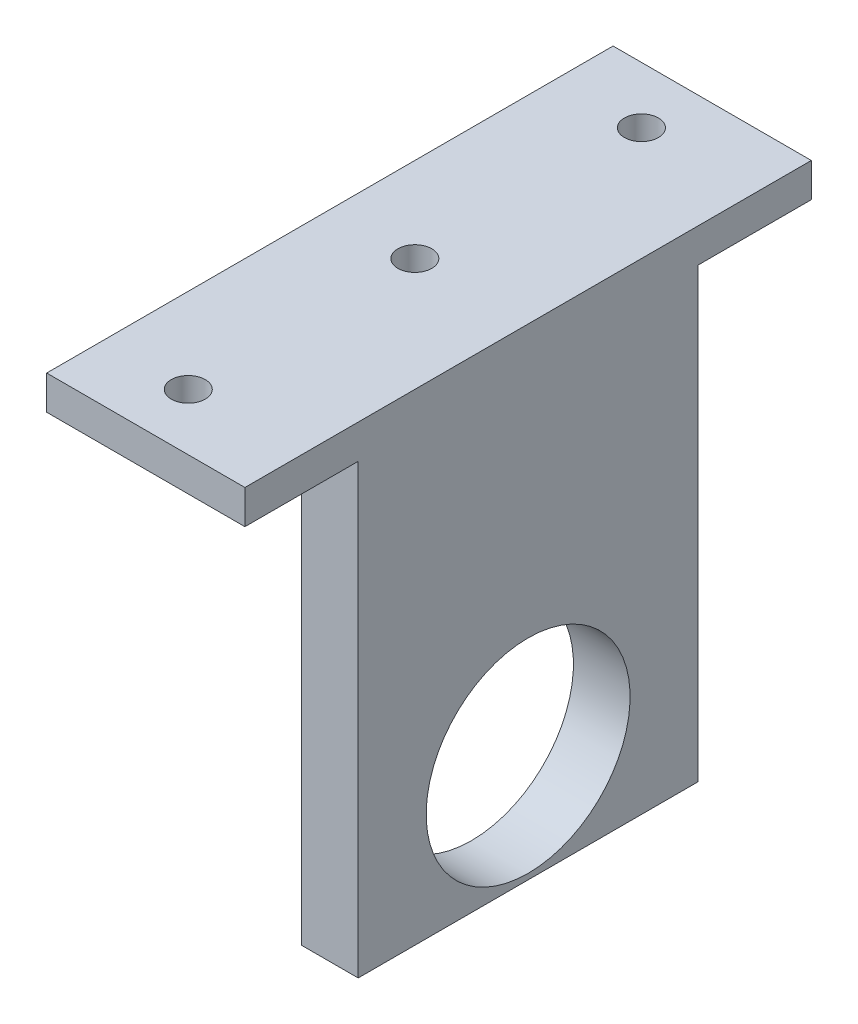
ISO-10303-21;
HEADER;
FILE_DESCRIPTION(('STEP AP214'),'2;1');
FILE_NAME('part.step','',(''),(''),'','','');
FILE_SCHEMA(('AUTOMOTIVE_DESIGN { 1 0 10303 214 1 1 1 1 }'));
ENDSEC;
DATA;
#1=APPLICATION_CONTEXT('core data for automotive mechanical design processes');
#2=APPLICATION_PROTOCOL_DEFINITION('international standard','automotive_design',2000,#1);
#3=PRODUCT_CONTEXT('',#1,'mechanical');
#4=PRODUCT('Part','Part','',(#3));
#5=PRODUCT_RELATED_PRODUCT_CATEGORY('part','',(#4));
#6=PRODUCT_DEFINITION_FORMATION('','',#4);
#7=PRODUCT_DEFINITION_CONTEXT('part definition',#1,'design');
#8=PRODUCT_DEFINITION('design','',#6,#7);
#9=PRODUCT_DEFINITION_SHAPE('','',#8);
#10=(LENGTH_UNIT() NAMED_UNIT(*) SI_UNIT(.MILLI.,.METRE.));
#11=(NAMED_UNIT(*) PLANE_ANGLE_UNIT() SI_UNIT($,.RADIAN.));
#12=(NAMED_UNIT(*) SI_UNIT($,.STERADIAN.) SOLID_ANGLE_UNIT());
#13=UNCERTAINTY_MEASURE_WITH_UNIT(LENGTH_MEASURE(1.E-05),#10,'distance_accuracy_value','');
#14=(GEOMETRIC_REPRESENTATION_CONTEXT(3) GLOBAL_UNCERTAINTY_ASSIGNED_CONTEXT((#13)) GLOBAL_UNIT_ASSIGNED_CONTEXT((#10,
#11,#12)) REPRESENTATION_CONTEXT('',''));
#15=CARTESIAN_POINT('',(0.,0.,0.));
#16=DIRECTION('',(0.,0.,1.));
#17=DIRECTION('',(1.,0.,0.));
#18=AXIS2_PLACEMENT_3D('',#15,#16,#17);
#19=CARTESIAN_POINT('',(5.,-28.5,15.));
#20=DIRECTION('',(0.,0.,1.));
#21=DIRECTION('',(1.,0.,0.));
#22=AXIS2_PLACEMENT_3D('',#19,#20,#21);
#23=PLANE('',#22);
#24=DIRECTION('',(0.,1.,0.));
#25=VECTOR('',#24,1.);
#26=CARTESIAN_POINT('',(0.,-28.5,15.));
#27=LINE('',#26,#25);
#28=CARTESIAN_POINT('',(0.,-28.5,15.));
#29=VERTEX_POINT('',#28);
#30=CARTESIAN_POINT('',(0.,11.,15.));
#31=VERTEX_POINT('',#30);
#32=EDGE_CURVE('E142',#29,#31,#27,.T.);
#33=ORIENTED_EDGE('',*,*,#32,.F.);
#34=DIRECTION('',(-1.,0.,0.));
#35=VECTOR('',#34,1.);
#36=CARTESIAN_POINT('',(5.,-28.5,15.));
#37=LINE('',#36,#35);
#38=CARTESIAN_POINT('',(5.,-28.5,15.));
#39=VERTEX_POINT('',#38);
#40=EDGE_CURVE('E11',#39,#29,#37,.T.);
#41=ORIENTED_EDGE('',*,*,#40,.F.);
#42=DIRECTION('',(0.,1.,0.));
#43=VECTOR('',#42,1.);
#44=CARTESIAN_POINT('',(5.,-28.5,15.));
#45=LINE('',#44,#43);
#46=CARTESIAN_POINT('',(5.,11.,15.));
#47=VERTEX_POINT('',#46);
#48=EDGE_CURVE('E75',#39,#47,#45,.T.);
#49=ORIENTED_EDGE('',*,*,#48,.T.);
#50=DIRECTION('',(-1.,0.,0.));
#51=VECTOR('',#50,1.);
#52=CARTESIAN_POINT('',(5.,11.,15.));
#53=LINE('',#52,#51);
#54=EDGE_CURVE('E42',#47,#31,#53,.T.);
#55=ORIENTED_EDGE('',*,*,#54,.T.);
#56=EDGE_LOOP('',(#33,#41,#49,#55));
#57=FACE_BOUND('',#56,.T.);
#58=ADVANCED_FACE('F39',(#57),#23,.T.);
#59=CARTESIAN_POINT('',(5.,-28.5,15.));
#60=DIRECTION('',(0.,1.,0.));
#61=DIRECTION('',(0.,0.,1.));
#62=AXIS2_PLACEMENT_3D('',#59,#60,#61);
#63=PLANE('',#62);
#64=DIRECTION('',(0.,0.,-1.));
#65=VECTOR('',#64,1.);
#66=CARTESIAN_POINT('',(0.,-28.5,15.));
#67=LINE('',#66,#65);
#68=CARTESIAN_POINT('',(0.,-28.5,-15.));
#69=VERTEX_POINT('',#68);
#70=EDGE_CURVE('E70',#29,#69,#67,.T.);
#71=ORIENTED_EDGE('',*,*,#70,.T.);
#72=DIRECTION('',(-1.,0.,0.));
#73=VECTOR('',#72,1.);
#74=CARTESIAN_POINT('',(5.,-28.5,-15.));
#75=LINE('',#74,#73);
#76=CARTESIAN_POINT('',(5.,-28.5,-15.));
#77=VERTEX_POINT('',#76);
#78=EDGE_CURVE('E48',#77,#69,#75,.T.);
#79=ORIENTED_EDGE('',*,*,#78,.F.);
#80=DIRECTION('',(0.,0.,-1.));
#81=VECTOR('',#80,1.);
#82=CARTESIAN_POINT('',(5.,-28.5,15.));
#83=LINE('',#82,#81);
#84=EDGE_CURVE('E147',#39,#77,#83,.T.);
#85=ORIENTED_EDGE('',*,*,#84,.F.);
#86=ORIENTED_EDGE('',*,*,#40,.T.);
#87=EDGE_LOOP('',(#71,#79,#85,#86));
#88=FACE_BOUND('',#87,.T.);
#89=ADVANCED_FACE('F185',(#88),#63,.F.);
#90=CARTESIAN_POINT('',(5.,-28.5,-15.));
#91=DIRECTION('',(0.,0.,1.));
#92=DIRECTION('',(1.,0.,0.));
#93=AXIS2_PLACEMENT_3D('',#90,#91,#92);
#94=PLANE('',#93);
#95=DIRECTION('',(0.,1.,0.));
#96=VECTOR('',#95,1.);
#97=CARTESIAN_POINT('',(0.,-28.5,-15.));
#98=LINE('',#97,#96);
#99=CARTESIAN_POINT('',(0.,11.,-15.));
#100=VERTEX_POINT('',#99);
#101=EDGE_CURVE('E153',#69,#100,#98,.T.);
#102=ORIENTED_EDGE('',*,*,#101,.T.);
#103=DIRECTION('',(-1.,0.,0.));
#104=VECTOR('',#103,1.);
#105=CARTESIAN_POINT('',(5.,11.,-15.));
#106=LINE('',#105,#104);
#107=CARTESIAN_POINT('',(5.,11.,-15.));
#108=VERTEX_POINT('',#107);
#109=EDGE_CURVE('E157',#108,#100,#106,.T.);
#110=ORIENTED_EDGE('',*,*,#109,.F.);
#111=DIRECTION('',(0.,1.,0.));
#112=VECTOR('',#111,1.);
#113=CARTESIAN_POINT('',(5.,-28.5,-15.));
#114=LINE('',#113,#112);
#115=EDGE_CURVE('E145',#77,#108,#114,.T.);
#116=ORIENTED_EDGE('',*,*,#115,.F.);
#117=ORIENTED_EDGE('',*,*,#78,.T.);
#118=EDGE_LOOP('',(#102,#110,#116,#117));
#119=FACE_BOUND('',#118,.T.);
#120=ADVANCED_FACE('F189',(#119),#94,.F.);
#121=CARTESIAN_POINT('',(5.,0.,0.));
#122=DIRECTION('',(-1.,0.,0.));
#123=DIRECTION('',(0.,0.,1.));
#124=AXIS2_PLACEMENT_3D('',#121,#122,#123);
#125=PLANE('',#124);
#126=CARTESIAN_POINT('',(5.00000000000011,-19.,0.));
#127=DIRECTION('',(1.,0.,0.));
#128=DIRECTION('',(0.,1.,0.));
#129=AXIS2_PLACEMENT_3D('',#126,#127,#128);
#130=CIRCLE('',#129,9.);
#131=CARTESIAN_POINT('',(5.00000000000005,-9.99999999999997,0.));
#132=VERTEX_POINT('',#131);
#133=EDGE_CURVE('E132',#132,#132,#130,.T.);
#134=ORIENTED_EDGE('',*,*,#133,.F.);
#135=EDGE_LOOP('',(#134));
#136=FACE_BOUND('',#135,.T.);
#137=ORIENTED_EDGE('',*,*,#48,.F.);
#138=ORIENTED_EDGE('',*,*,#84,.T.);
#139=ORIENTED_EDGE('',*,*,#115,.T.);
#140=DIRECTION('',(0.,0.,-1.));
#141=VECTOR('',#140,1.);
#142=CARTESIAN_POINT('',(5.,11.0000000000002,25.));
#143=LINE('',#142,#141);
#144=CARTESIAN_POINT('',(4.99999999999999,10.9999999999998,-25.));
#145=VERTEX_POINT('',#144);
#146=EDGE_CURVE('E222',#108,#145,#143,.T.);
#147=ORIENTED_EDGE('',*,*,#146,.T.);
#148=DIRECTION('',(0.,-1.,0.));
#149=VECTOR('',#148,1.);
#150=CARTESIAN_POINT('',(4.99999999999999,13.9999999999998,-25.));
#151=LINE('',#150,#149);
#152=CARTESIAN_POINT('',(4.99999999999999,13.9999999999998,-25.));
#153=VERTEX_POINT('',#152);
#154=EDGE_CURVE('E137',#153,#145,#151,.T.);
#155=ORIENTED_EDGE('',*,*,#154,.F.);
#156=DIRECTION('',(0.,0.,-1.));
#157=VECTOR('',#156,1.);
#158=CARTESIAN_POINT('',(5.,14.0000000000002,25.));
#159=LINE('',#158,#157);
#160=CARTESIAN_POINT('',(5.,14.0000000000002,25.));
#161=VERTEX_POINT('',#160);
#162=EDGE_CURVE('E117',#161,#153,#159,.T.);
#163=ORIENTED_EDGE('',*,*,#162,.F.);
#164=DIRECTION('',(0.,-1.,0.));
#165=VECTOR('',#164,1.);
#166=CARTESIAN_POINT('',(5.,14.0000000000002,25.));
#167=LINE('',#166,#165);
#168=CARTESIAN_POINT('',(5.,11.0000000000002,25.));
#169=VERTEX_POINT('',#168);
#170=EDGE_CURVE('E114',#161,#169,#167,.T.);
#171=ORIENTED_EDGE('',*,*,#170,.T.);
#172=EDGE_CURVE('E216',#169,#47,#143,.T.);
#173=ORIENTED_EDGE('',*,*,#172,.T.);
#174=EDGE_LOOP('',(#137,#138,#139,#147,#155,#163,#171,#173));
#175=FACE_BOUND('',#174,.T.);
#176=ADVANCED_FACE('F194',(#136,#175),#125,.F.);
#177=CARTESIAN_POINT('',(0.,0.,0.));
#178=DIRECTION('',(-1.,0.,0.));
#179=DIRECTION('',(0.,0.,1.));
#180=AXIS2_PLACEMENT_3D('',#177,#178,#179);
#181=PLANE('',#180);
#182=CARTESIAN_POINT('',(1.13624387676481E-13,-19.,0.));
#183=DIRECTION('',(1.,0.,0.));
#184=DIRECTION('',(0.,1.,0.));
#185=AXIS2_PLACEMENT_3D('',#182,#183,#184);
#186=CIRCLE('',#185,9.);
#187=CARTESIAN_POINT('',(0.,-10.,0.));
#188=VERTEX_POINT('',#187);
#189=EDGE_CURVE('E135',#188,#188,#186,.T.);
#190=ORIENTED_EDGE('',*,*,#189,.T.);
#191=EDGE_LOOP('',(#190));
#192=FACE_BOUND('',#191,.T.);
#193=ORIENTED_EDGE('',*,*,#32,.T.);
#194=DIRECTION('',(0.,0.,-1.));
#195=VECTOR('',#194,1.);
#196=CARTESIAN_POINT('',(0.,11.,15.));
#197=LINE('',#196,#195);
#198=EDGE_CURVE('E151',#31,#100,#197,.T.);
#199=ORIENTED_EDGE('',*,*,#198,.T.);
#200=ORIENTED_EDGE('',*,*,#101,.F.);
#201=ORIENTED_EDGE('',*,*,#70,.F.);
#202=EDGE_LOOP('',(#193,#199,#200,#201));
#203=FACE_BOUND('',#202,.T.);
#204=ADVANCED_FACE('F166',(#192,#203),#181,.T.);
#205=CARTESIAN_POINT('',(1.13624387676481E-13,-19.,0.));
#206=DIRECTION('',(1.,0.,0.));
#207=DIRECTION('',(0.,1.,0.));
#208=AXIS2_PLACEMENT_3D('',#205,#206,#207);
#209=CYLINDRICAL_SURFACE('',#208,9.);
#210=ORIENTED_EDGE('',*,*,#189,.F.);
#211=EDGE_LOOP('',(#210));
#212=FACE_BOUND('',#211,.T.);
#213=ORIENTED_EDGE('',*,*,#133,.T.);
#214=EDGE_LOOP('',(#213));
#215=FACE_BOUND('',#214,.T.);
#216=ADVANCED_FACE('F170',(#212,#215),#209,.F.);
#217=CARTESIAN_POINT('',(0.,11.,0.));
#218=DIRECTION('',(0.,-1.,0.));
#219=DIRECTION('',(0.,0.,-1.));
#220=AXIS2_PLACEMENT_3D('',#217,#218,#219);
#221=PLANE('',#220);
#222=CARTESIAN_POINT('',(-5.00000000000002,11.0000000000003,20.));
#223=DIRECTION('',(0.,1.,0.));
#224=DIRECTION('',(0.,0.,1.));
#225=AXIS2_PLACEMENT_3D('',#222,#223,#224);
#226=CIRCLE('',#225,1.5);
#227=CARTESIAN_POINT('',(-5.00000000000002,11.0000000000003,21.5));
#228=VERTEX_POINT('',#227);
#229=EDGE_CURVE('E236',#228,#228,#226,.T.);
#230=ORIENTED_EDGE('',*,*,#229,.T.);
#231=EDGE_LOOP('',(#230));
#232=FACE_BOUND('',#231,.T.);
#233=CARTESIAN_POINT('',(-5.00000000000007,10.9999999999997,-20.));
#234=DIRECTION('',(0.,1.,0.));
#235=DIRECTION('',(0.,0.,1.));
#236=AXIS2_PLACEMENT_3D('',#233,#234,#235);
#237=CIRCLE('',#236,1.5);
#238=CARTESIAN_POINT('',(-5.00000000000007,10.9999999999997,-18.5));
#239=VERTEX_POINT('',#238);
#240=EDGE_CURVE('E241',#239,#239,#237,.T.);
#241=ORIENTED_EDGE('',*,*,#240,.T.);
#242=EDGE_LOOP('',(#241));
#243=FACE_BOUND('',#242,.T.);
#244=CARTESIAN_POINT('',(-5.,11.,0.));
#245=DIRECTION('',(0.,1.,0.));
#246=DIRECTION('',(0.,0.,1.));
#247=AXIS2_PLACEMENT_3D('',#244,#245,#246);
#248=CIRCLE('',#247,1.5);
#249=CARTESIAN_POINT('',(-5.,11.,1.50000000000002));
#250=VERTEX_POINT('',#249);
#251=EDGE_CURVE('E220',#250,#250,#248,.T.);
#252=ORIENTED_EDGE('',*,*,#251,.T.);
#253=EDGE_LOOP('',(#252));
#254=FACE_BOUND('',#253,.T.);
#255=ORIENTED_EDGE('',*,*,#54,.F.);
#256=ORIENTED_EDGE('',*,*,#172,.F.);
#257=DIRECTION('',(1.,0.,0.));
#258=VECTOR('',#257,1.);
#259=CARTESIAN_POINT('',(5.,11.0000000000002,25.));
#260=LINE('',#259,#258);
#261=CARTESIAN_POINT('',(-12.5,11.0000000000002,25.));
#262=VERTEX_POINT('',#261);
#263=EDGE_CURVE('E219',#262,#169,#260,.T.);
#264=ORIENTED_EDGE('',*,*,#263,.F.);
#265=DIRECTION('',(0.,0.,1.));
#266=VECTOR('',#265,1.);
#267=CARTESIAN_POINT('',(-12.5,10.9999999999998,-25.));
#268=LINE('',#267,#266);
#269=CARTESIAN_POINT('',(-12.5,10.9999999999998,-25.));
#270=VERTEX_POINT('',#269);
#271=EDGE_CURVE('E131',#270,#262,#268,.T.);
#272=ORIENTED_EDGE('',*,*,#271,.F.);
#273=DIRECTION('',(-1.,0.,0.));
#274=VECTOR('',#273,1.);
#275=CARTESIAN_POINT('',(4.99999999999999,10.9999999999998,-25.));
#276=LINE('',#275,#274);
#277=EDGE_CURVE('E127',#145,#270,#276,.T.);
#278=ORIENTED_EDGE('',*,*,#277,.F.);
#279=ORIENTED_EDGE('',*,*,#146,.F.);
#280=ORIENTED_EDGE('',*,*,#109,.T.);
#281=ORIENTED_EDGE('',*,*,#198,.F.);
#282=EDGE_LOOP('',(#255,#256,#264,#272,#278,#279,#280,#281));
#283=FACE_BOUND('',#282,.T.);
#284=ADVANCED_FACE('F168',(#232,#243,#254,#283),#221,.T.);
#285=CARTESIAN_POINT('',(-12.5,13.9999999999998,-25.));
#286=DIRECTION('',(1.,0.,0.));
#287=DIRECTION('',(0.,0.,-1.));
#288=AXIS2_PLACEMENT_3D('',#285,#286,#287);
#289=PLANE('',#288);
#290=ORIENTED_EDGE('',*,*,#271,.T.);
#291=DIRECTION('',(0.,-1.,0.));
#292=VECTOR('',#291,1.);
#293=CARTESIAN_POINT('',(-12.5,14.0000000000002,25.));
#294=LINE('',#293,#292);
#295=CARTESIAN_POINT('',(-12.5,14.0000000000002,25.));
#296=VERTEX_POINT('',#295);
#297=EDGE_CURVE('E111',#296,#262,#294,.T.);
#298=ORIENTED_EDGE('',*,*,#297,.F.);
#299=DIRECTION('',(0.,0.,1.));
#300=VECTOR('',#299,1.);
#301=CARTESIAN_POINT('',(-12.5,13.9999999999998,-25.));
#302=LINE('',#301,#300);
#303=CARTESIAN_POINT('',(-12.5,13.9999999999998,-25.));
#304=VERTEX_POINT('',#303);
#305=EDGE_CURVE('E118',#304,#296,#302,.T.);
#306=ORIENTED_EDGE('',*,*,#305,.F.);
#307=DIRECTION('',(0.,-1.,0.));
#308=VECTOR('',#307,1.);
#309=CARTESIAN_POINT('',(-12.5,13.9999999999998,-25.));
#310=LINE('',#309,#308);
#311=EDGE_CURVE('E214',#304,#270,#310,.T.);
#312=ORIENTED_EDGE('',*,*,#311,.T.);
#313=EDGE_LOOP('',(#290,#298,#306,#312));
#314=FACE_BOUND('',#313,.T.);
#315=ADVANCED_FACE('F129',(#314),#289,.F.);
#316=CARTESIAN_POINT('',(5.,14.0000000000002,25.));
#317=DIRECTION('',(0.,0.,-1.));
#318=DIRECTION('',(0.,1.,0.));
#319=AXIS2_PLACEMENT_3D('',#316,#317,#318);
#320=PLANE('',#319);
#321=ORIENTED_EDGE('',*,*,#263,.T.);
#322=ORIENTED_EDGE('',*,*,#170,.F.);
#323=DIRECTION('',(1.,0.,0.));
#324=VECTOR('',#323,1.);
#325=CARTESIAN_POINT('',(5.,14.0000000000002,25.));
#326=LINE('',#325,#324);
#327=EDGE_CURVE('E107',#296,#161,#326,.T.);
#328=ORIENTED_EDGE('',*,*,#327,.F.);
#329=ORIENTED_EDGE('',*,*,#297,.T.);
#330=EDGE_LOOP('',(#321,#322,#328,#329));
#331=FACE_BOUND('',#330,.T.);
#332=ADVANCED_FACE('F109',(#331),#320,.F.);
#333=CARTESIAN_POINT('',(4.99999999999999,13.9999999999998,-25.));
#334=DIRECTION('',(0.,0.,1.));
#335=DIRECTION('',(0.,-1.,0.));
#336=AXIS2_PLACEMENT_3D('',#333,#334,#335);
#337=PLANE('',#336);
#338=ORIENTED_EDGE('',*,*,#277,.T.);
#339=ORIENTED_EDGE('',*,*,#311,.F.);
#340=DIRECTION('',(-1.,0.,0.));
#341=VECTOR('',#340,1.);
#342=CARTESIAN_POINT('',(4.99999999999999,13.9999999999998,-25.));
#343=LINE('',#342,#341);
#344=EDGE_CURVE('E123',#153,#304,#343,.T.);
#345=ORIENTED_EDGE('',*,*,#344,.F.);
#346=ORIENTED_EDGE('',*,*,#154,.T.);
#347=EDGE_LOOP('',(#338,#339,#345,#346));
#348=FACE_BOUND('',#347,.T.);
#349=ADVANCED_FACE('F204',(#348),#337,.F.);
#350=CARTESIAN_POINT('',(0.,14.,0.));
#351=DIRECTION('',(0.,-1.,0.));
#352=DIRECTION('',(0.,0.,-1.));
#353=AXIS2_PLACEMENT_3D('',#350,#351,#352);
#354=PLANE('',#353);
#355=CARTESIAN_POINT('',(-5.00000000000002,14.0000000000003,20.));
#356=DIRECTION('',(0.,1.,0.));
#357=DIRECTION('',(0.,0.,1.));
#358=AXIS2_PLACEMENT_3D('',#355,#356,#357);
#359=CIRCLE('',#358,1.5);
#360=CARTESIAN_POINT('',(-5.00000000000002,14.0000000000003,21.5));
#361=VERTEX_POINT('',#360);
#362=EDGE_CURVE('E238',#361,#361,#359,.T.);
#363=ORIENTED_EDGE('',*,*,#362,.F.);
#364=EDGE_LOOP('',(#363));
#365=FACE_BOUND('',#364,.T.);
#366=CARTESIAN_POINT('',(-5.00000000000007,13.9999999999997,-20.));
#367=DIRECTION('',(0.,1.,0.));
#368=DIRECTION('',(0.,0.,1.));
#369=AXIS2_PLACEMENT_3D('',#366,#367,#368);
#370=CIRCLE('',#369,1.5);
#371=CARTESIAN_POINT('',(-5.00000000000007,13.9999999999997,-18.5));
#372=VERTEX_POINT('',#371);
#373=EDGE_CURVE('E234',#372,#372,#370,.T.);
#374=ORIENTED_EDGE('',*,*,#373,.F.);
#375=EDGE_LOOP('',(#374));
#376=FACE_BOUND('',#375,.T.);
#377=CARTESIAN_POINT('',(-5.,14.,0.));
#378=DIRECTION('',(0.,1.,0.));
#379=DIRECTION('',(0.,0.,1.));
#380=AXIS2_PLACEMENT_3D('',#377,#378,#379);
#381=CIRCLE('',#380,1.5);
#382=CARTESIAN_POINT('',(-5.,14.,1.49999999999998));
#383=VERTEX_POINT('',#382);
#384=EDGE_CURVE('E225',#383,#383,#381,.T.);
#385=ORIENTED_EDGE('',*,*,#384,.F.);
#386=EDGE_LOOP('',(#385));
#387=FACE_BOUND('',#386,.T.);
#388=ORIENTED_EDGE('',*,*,#305,.T.);
#389=ORIENTED_EDGE('',*,*,#327,.T.);
#390=ORIENTED_EDGE('',*,*,#162,.T.);
#391=ORIENTED_EDGE('',*,*,#344,.T.);
#392=EDGE_LOOP('',(#388,#389,#390,#391));
#393=FACE_BOUND('',#392,.T.);
#394=ADVANCED_FACE('F121',(#365,#376,#387,#393),#354,.F.);
#395=CARTESIAN_POINT('',(-5.,11.,0.));
#396=DIRECTION('',(0.,1.,0.));
#397=DIRECTION('',(0.,0.,1.));
#398=AXIS2_PLACEMENT_3D('',#395,#396,#397);
#399=CYLINDRICAL_SURFACE('',#398,1.5);
#400=ORIENTED_EDGE('',*,*,#251,.F.);
#401=EDGE_LOOP('',(#400));
#402=FACE_BOUND('',#401,.T.);
#403=ORIENTED_EDGE('',*,*,#384,.T.);
#404=EDGE_LOOP('',(#403));
#405=FACE_BOUND('',#404,.T.);
#406=ADVANCED_FACE('F210',(#402,#405),#399,.F.);
#407=CARTESIAN_POINT('',(-5.00000000000007,10.9999999999997,-20.));
#408=DIRECTION('',(0.,1.,0.));
#409=DIRECTION('',(0.,0.,1.));
#410=AXIS2_PLACEMENT_3D('',#407,#408,#409);
#411=CYLINDRICAL_SURFACE('',#410,1.5);
#412=ORIENTED_EDGE('',*,*,#240,.F.);
#413=EDGE_LOOP('',(#412));
#414=FACE_BOUND('',#413,.T.);
#415=ORIENTED_EDGE('',*,*,#373,.T.);
#416=EDGE_LOOP('',(#415));
#417=FACE_BOUND('',#416,.T.);
#418=ADVANCED_FACE('F247',(#414,#417),#411,.F.);
#419=CARTESIAN_POINT('',(-5.00000000000002,11.0000000000003,20.));
#420=DIRECTION('',(0.,1.,0.));
#421=DIRECTION('',(0.,0.,1.));
#422=AXIS2_PLACEMENT_3D('',#419,#420,#421);
#423=CYLINDRICAL_SURFACE('',#422,1.5);
#424=ORIENTED_EDGE('',*,*,#229,.F.);
#425=EDGE_LOOP('',(#424));
#426=FACE_BOUND('',#425,.T.);
#427=ORIENTED_EDGE('',*,*,#362,.T.);
#428=EDGE_LOOP('',(#427));
#429=FACE_BOUND('',#428,.T.);
#430=ADVANCED_FACE('F258',(#426,#429),#423,.F.);
#431=CLOSED_SHELL('',(#58,#89,#120,#176,#204,#216,#284,#315,#332,#349,#394,#406,#418,#430));
#432=MANIFOLD_SOLID_BREP('B2',#431);
#433=ADVANCED_BREP_SHAPE_REPRESENTATION('',(#18,#432),#14);
#434=SHAPE_DEFINITION_REPRESENTATION(#9,#433);
ENDSEC;
END-ISO-10303-21;
